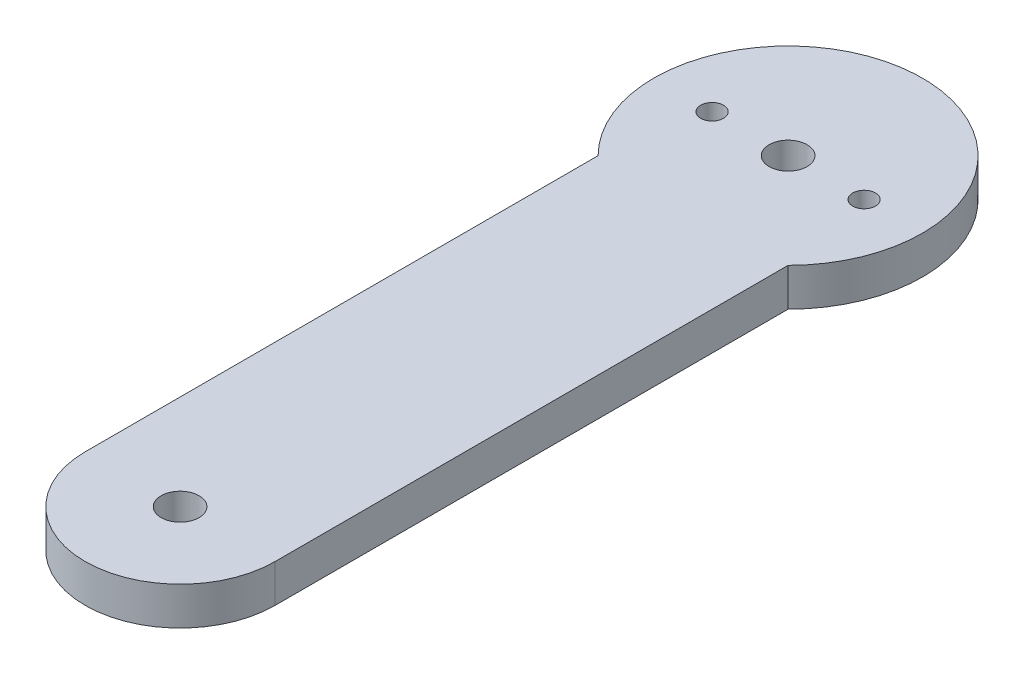
ISO-10303-21;
HEADER;
FILE_DESCRIPTION(('STEP AP214'),'2;1');
FILE_NAME('part.step','',(''),(''),'','','');
FILE_SCHEMA(('AUTOMOTIVE_DESIGN { 1 0 10303 214 1 1 1 1 }'));
ENDSEC;
DATA;
#1=APPLICATION_CONTEXT('core data for automotive mechanical design processes');
#2=APPLICATION_PROTOCOL_DEFINITION('international standard','automotive_design',2000,#1);
#3=PRODUCT_CONTEXT('',#1,'mechanical');
#4=PRODUCT('Part','Part','',(#3));
#5=PRODUCT_RELATED_PRODUCT_CATEGORY('part','',(#4));
#6=PRODUCT_DEFINITION_FORMATION('','',#4);
#7=PRODUCT_DEFINITION_CONTEXT('part definition',#1,'design');
#8=PRODUCT_DEFINITION('design','',#6,#7);
#9=PRODUCT_DEFINITION_SHAPE('','',#8);
#10=(LENGTH_UNIT() NAMED_UNIT(*) SI_UNIT(.MILLI.,.METRE.));
#11=(NAMED_UNIT(*) PLANE_ANGLE_UNIT() SI_UNIT($,.RADIAN.));
#12=(NAMED_UNIT(*) SI_UNIT($,.STERADIAN.) SOLID_ANGLE_UNIT());
#13=UNCERTAINTY_MEASURE_WITH_UNIT(LENGTH_MEASURE(1.E-05),#10,'distance_accuracy_value','');
#14=(GEOMETRIC_REPRESENTATION_CONTEXT(3) GLOBAL_UNCERTAINTY_ASSIGNED_CONTEXT((#13)) GLOBAL_UNIT_ASSIGNED_CONTEXT((#10,
#11,#12)) REPRESENTATION_CONTEXT('',''));
#15=CARTESIAN_POINT('',(0.,0.,0.));
#16=DIRECTION('',(0.,0.,1.));
#17=DIRECTION('',(1.,0.,0.));
#18=AXIS2_PLACEMENT_3D('',#15,#16,#17);
#19=CARTESIAN_POINT('',(0.,5.,0.));
#20=DIRECTION('',(0.,-1.,0.));
#21=DIRECTION('',(0.,0.,-1.));
#22=AXIS2_PLACEMENT_3D('',#19,#20,#21);
#23=PLANE('',#22);
#24=CARTESIAN_POINT('',(0.,5.,0.));
#25=DIRECTION('',(0.,1.,0.));
#26=DIRECTION('',(0.,0.,-1.));
#27=AXIS2_PLACEMENT_3D('',#24,#25,#26);
#28=CIRCLE('',#27,12.5);
#29=CARTESIAN_POINT('',(-12.5,5.,0.));
#30=VERTEX_POINT('',#29);
#31=CARTESIAN_POINT('',(12.5,5.,0.));
#32=VERTEX_POINT('',#31);
#33=EDGE_CURVE('E92',#30,#32,#28,.T.);
#34=ORIENTED_EDGE('',*,*,#33,.T.);
#35=DIRECTION('',(0.,0.,-1.));
#36=VECTOR('',#35,1.);
#37=CARTESIAN_POINT('',(12.5,5.,-67.5));
#38=LINE('',#37,#36);
#39=CARTESIAN_POINT('',(12.5,5.,-67.5));
#40=VERTEX_POINT('',#39);
#41=EDGE_CURVE('E87',#32,#40,#38,.T.);
#42=ORIENTED_EDGE('',*,*,#41,.T.);
#43=CARTESIAN_POINT('',(0.,5.,-80.));
#44=DIRECTION('',(0.,1.,0.));
#45=DIRECTION('',(0.,0.,1.));
#46=AXIS2_PLACEMENT_3D('',#43,#44,#45);
#47=CIRCLE('',#46,17.6776695296637);
#48=CARTESIAN_POINT('',(-12.5,5.,-67.5));
#49=VERTEX_POINT('',#48);
#50=EDGE_CURVE('E90',#40,#49,#47,.T.);
#51=ORIENTED_EDGE('',*,*,#50,.T.);
#52=DIRECTION('',(0.,0.,1.));
#53=VECTOR('',#52,1.);
#54=CARTESIAN_POINT('',(-12.5,5.,-67.5));
#55=LINE('',#54,#53);
#56=EDGE_CURVE('E57',#49,#30,#55,.T.);
#57=ORIENTED_EDGE('',*,*,#56,.T.);
#58=EDGE_LOOP('',(#34,#42,#51,#57));
#59=FACE_BOUND('',#58,.T.);
#60=CARTESIAN_POINT('',(0.,5.,0.));
#61=DIRECTION('',(0.,1.,0.));
#62=DIRECTION('',(0.,0.,1.));
#63=AXIS2_PLACEMENT_3D('',#60,#61,#62);
#64=CIRCLE('',#63,2.5);
#65=CARTESIAN_POINT('',(0.,5.,2.5));
#66=VERTEX_POINT('',#65);
#67=EDGE_CURVE('E112',#66,#66,#64,.T.);
#68=ORIENTED_EDGE('',*,*,#67,.F.);
#69=EDGE_LOOP('',(#68));
#70=FACE_BOUND('',#69,.T.);
#71=CARTESIAN_POINT('',(0.,5.,-80.));
#72=DIRECTION('',(0.,1.,0.));
#73=DIRECTION('',(0.,0.,1.));
#74=AXIS2_PLACEMENT_3D('',#71,#72,#73);
#75=CIRCLE('',#74,2.5);
#76=CARTESIAN_POINT('',(0.,5.,-77.5));
#77=VERTEX_POINT('',#76);
#78=EDGE_CURVE('E134',#77,#77,#75,.T.);
#79=ORIENTED_EDGE('',*,*,#78,.F.);
#80=EDGE_LOOP('',(#79));
#81=FACE_BOUND('',#80,.T.);
#82=CARTESIAN_POINT('',(10.,5.,-80.));
#83=DIRECTION('',(0.,1.,0.));
#84=DIRECTION('',(0.,0.,1.));
#85=AXIS2_PLACEMENT_3D('',#82,#83,#84);
#86=CIRCLE('',#85,1.5);
#87=CARTESIAN_POINT('',(10.,5.,-78.5));
#88=VERTEX_POINT('',#87);
#89=EDGE_CURVE('E142',#88,#88,#86,.T.);
#90=ORIENTED_EDGE('',*,*,#89,.F.);
#91=EDGE_LOOP('',(#90));
#92=FACE_BOUND('',#91,.T.);
#93=CARTESIAN_POINT('',(-10.,5.,-80.));
#94=DIRECTION('',(0.,1.,0.));
#95=DIRECTION('',(0.,0.,-1.));
#96=AXIS2_PLACEMENT_3D('',#93,#94,#95);
#97=CIRCLE('',#96,1.5);
#98=CARTESIAN_POINT('',(-10.,5.,-81.5));
#99=VERTEX_POINT('',#98);
#100=EDGE_CURVE('E150',#99,#99,#97,.T.);
#101=ORIENTED_EDGE('',*,*,#100,.F.);
#102=EDGE_LOOP('',(#101));
#103=FACE_BOUND('',#102,.T.);
#104=ADVANCED_FACE('F39',(#59,#70,#81,#92,#103),#23,.F.);
#105=CARTESIAN_POINT('',(0.,0.,0.));
#106=DIRECTION('',(0.,-1.,0.));
#107=DIRECTION('',(0.,0.,-1.));
#108=AXIS2_PLACEMENT_3D('',#105,#106,#107);
#109=PLANE('',#108);
#110=CARTESIAN_POINT('',(10.,0.,-80.));
#111=DIRECTION('',(0.,1.,0.));
#112=DIRECTION('',(0.,0.,1.));
#113=AXIS2_PLACEMENT_3D('',#110,#111,#112);
#114=CIRCLE('',#113,1.5);
#115=CARTESIAN_POINT('',(10.,0.,-78.5));
#116=VERTEX_POINT('',#115);
#117=EDGE_CURVE('E146',#116,#116,#114,.T.);
#118=ORIENTED_EDGE('',*,*,#117,.T.);
#119=EDGE_LOOP('',(#118));
#120=FACE_BOUND('',#119,.T.);
#121=CARTESIAN_POINT('',(0.,0.,0.));
#122=DIRECTION('',(0.,1.,0.));
#123=DIRECTION('',(0.,0.,1.));
#124=AXIS2_PLACEMENT_3D('',#121,#122,#123);
#125=CIRCLE('',#124,2.5);
#126=CARTESIAN_POINT('',(0.,0.,2.5));
#127=VERTEX_POINT('',#126);
#128=EDGE_CURVE('E130',#127,#127,#125,.T.);
#129=ORIENTED_EDGE('',*,*,#128,.T.);
#130=EDGE_LOOP('',(#129));
#131=FACE_BOUND('',#130,.T.);
#132=CARTESIAN_POINT('',(0.,0.,0.));
#133=DIRECTION('',(0.,1.,0.));
#134=DIRECTION('',(0.,0.,-1.));
#135=AXIS2_PLACEMENT_3D('',#132,#133,#134);
#136=CIRCLE('',#135,12.5);
#137=CARTESIAN_POINT('',(-12.5,0.,0.));
#138=VERTEX_POINT('',#137);
#139=CARTESIAN_POINT('',(12.5,0.,0.));
#140=VERTEX_POINT('',#139);
#141=EDGE_CURVE('E108',#138,#140,#136,.T.);
#142=ORIENTED_EDGE('',*,*,#141,.F.);
#143=DIRECTION('',(0.,0.,1.));
#144=VECTOR('',#143,1.);
#145=CARTESIAN_POINT('',(-12.5,0.,-67.5));
#146=LINE('',#145,#144);
#147=CARTESIAN_POINT('',(-12.5,0.,-67.5));
#148=VERTEX_POINT('',#147);
#149=EDGE_CURVE('E80',#148,#138,#146,.T.);
#150=ORIENTED_EDGE('',*,*,#149,.F.);
#151=CARTESIAN_POINT('',(0.,0.,-80.));
#152=DIRECTION('',(0.,1.,0.));
#153=DIRECTION('',(0.,0.,1.));
#154=AXIS2_PLACEMENT_3D('',#151,#152,#153);
#155=CIRCLE('',#154,17.6776695296637);
#156=CARTESIAN_POINT('',(12.5,0.,-67.5));
#157=VERTEX_POINT('',#156);
#158=EDGE_CURVE('E74',#157,#148,#155,.T.);
#159=ORIENTED_EDGE('',*,*,#158,.F.);
#160=DIRECTION('',(0.,0.,-1.));
#161=VECTOR('',#160,1.);
#162=CARTESIAN_POINT('',(12.5,0.,-67.5));
#163=LINE('',#162,#161);
#164=EDGE_CURVE('E97',#140,#157,#163,.T.);
#165=ORIENTED_EDGE('',*,*,#164,.F.);
#166=EDGE_LOOP('',(#142,#150,#159,#165));
#167=FACE_BOUND('',#166,.T.);
#168=CARTESIAN_POINT('',(0.,0.,-80.));
#169=DIRECTION('',(0.,1.,0.));
#170=DIRECTION('',(0.,0.,1.));
#171=AXIS2_PLACEMENT_3D('',#168,#169,#170);
#172=CIRCLE('',#171,2.5);
#173=CARTESIAN_POINT('',(0.,0.,-77.5));
#174=VERTEX_POINT('',#173);
#175=EDGE_CURVE('E138',#174,#174,#172,.T.);
#176=ORIENTED_EDGE('',*,*,#175,.T.);
#177=EDGE_LOOP('',(#176));
#178=FACE_BOUND('',#177,.T.);
#179=CARTESIAN_POINT('',(-10.,0.,-80.));
#180=DIRECTION('',(0.,1.,0.));
#181=DIRECTION('',(0.,0.,-1.));
#182=AXIS2_PLACEMENT_3D('',#179,#180,#181);
#183=CIRCLE('',#182,1.5);
#184=CARTESIAN_POINT('',(-10.,0.,-81.5));
#185=VERTEX_POINT('',#184);
#186=EDGE_CURVE('E154',#185,#185,#183,.T.);
#187=ORIENTED_EDGE('',*,*,#186,.T.);
#188=EDGE_LOOP('',(#187));
#189=FACE_BOUND('',#188,.T.);
#190=ADVANCED_FACE('F125',(#120,#131,#167,#178,#189),#109,.T.);
#191=CARTESIAN_POINT('',(0.,5.,0.));
#192=DIRECTION('',(0.,-1.,0.));
#193=DIRECTION('',(0.,0.,-1.));
#194=AXIS2_PLACEMENT_3D('',#191,#192,#193);
#195=CYLINDRICAL_SURFACE('',#194,12.5);
#196=ORIENTED_EDGE('',*,*,#141,.T.);
#197=DIRECTION('',(0.,-1.,0.));
#198=VECTOR('',#197,1.);
#199=CARTESIAN_POINT('',(12.5,5.,0.));
#200=LINE('',#199,#198);
#201=EDGE_CURVE('E11',#32,#140,#200,.T.);
#202=ORIENTED_EDGE('',*,*,#201,.F.);
#203=ORIENTED_EDGE('',*,*,#33,.F.);
#204=DIRECTION('',(0.,-1.,0.));
#205=VECTOR('',#204,1.);
#206=CARTESIAN_POINT('',(-12.5,5.,0.));
#207=LINE('',#206,#205);
#208=EDGE_CURVE('E104',#30,#138,#207,.T.);
#209=ORIENTED_EDGE('',*,*,#208,.T.);
#210=EDGE_LOOP('',(#196,#202,#203,#209));
#211=FACE_BOUND('',#210,.T.);
#212=ADVANCED_FACE('F41',(#211),#195,.T.);
#213=CARTESIAN_POINT('',(12.5,5.,-67.5));
#214=DIRECTION('',(-1.,0.,0.));
#215=DIRECTION('',(0.,0.,1.));
#216=AXIS2_PLACEMENT_3D('',#213,#214,#215);
#217=PLANE('',#216);
#218=ORIENTED_EDGE('',*,*,#164,.T.);
#219=DIRECTION('',(0.,-1.,0.));
#220=VECTOR('',#219,1.);
#221=CARTESIAN_POINT('',(12.5,5.,-67.5));
#222=LINE('',#221,#220);
#223=EDGE_CURVE('E49',#40,#157,#222,.T.);
#224=ORIENTED_EDGE('',*,*,#223,.F.);
#225=ORIENTED_EDGE('',*,*,#41,.F.);
#226=ORIENTED_EDGE('',*,*,#201,.T.);
#227=EDGE_LOOP('',(#218,#224,#225,#226));
#228=FACE_BOUND('',#227,.T.);
#229=ADVANCED_FACE('F96',(#228),#217,.F.);
#230=CARTESIAN_POINT('',(0.,5.,-80.));
#231=DIRECTION('',(0.,-1.,0.));
#232=DIRECTION('',(0.,0.,-1.));
#233=AXIS2_PLACEMENT_3D('',#230,#231,#232);
#234=CYLINDRICAL_SURFACE('',#233,17.6776695296637);
#235=ORIENTED_EDGE('',*,*,#158,.T.);
#236=DIRECTION('',(0.,-1.,0.));
#237=VECTOR('',#236,1.);
#238=CARTESIAN_POINT('',(-12.5,5.,-67.5));
#239=LINE('',#238,#237);
#240=EDGE_CURVE('E99',#49,#148,#239,.T.);
#241=ORIENTED_EDGE('',*,*,#240,.F.);
#242=ORIENTED_EDGE('',*,*,#50,.F.);
#243=ORIENTED_EDGE('',*,*,#223,.T.);
#244=EDGE_LOOP('',(#235,#241,#242,#243));
#245=FACE_BOUND('',#244,.T.);
#246=ADVANCED_FACE('F100',(#245),#234,.T.);
#247=CARTESIAN_POINT('',(-12.5,5.,-67.5));
#248=DIRECTION('',(1.,0.,0.));
#249=DIRECTION('',(0.,0.,-1.));
#250=AXIS2_PLACEMENT_3D('',#247,#248,#249);
#251=PLANE('',#250);
#252=ORIENTED_EDGE('',*,*,#149,.T.);
#253=ORIENTED_EDGE('',*,*,#208,.F.);
#254=ORIENTED_EDGE('',*,*,#56,.F.);
#255=ORIENTED_EDGE('',*,*,#240,.T.);
#256=EDGE_LOOP('',(#252,#253,#254,#255));
#257=FACE_BOUND('',#256,.T.);
#258=ADVANCED_FACE('F122',(#257),#251,.F.);
#259=CARTESIAN_POINT('',(0.,5.,0.));
#260=DIRECTION('',(0.,-1.,0.));
#261=DIRECTION('',(0.,0.,-1.));
#262=AXIS2_PLACEMENT_3D('',#259,#260,#261);
#263=CYLINDRICAL_SURFACE('',#262,2.5);
#264=ORIENTED_EDGE('',*,*,#67,.T.);
#265=EDGE_LOOP('',(#264));
#266=FACE_BOUND('',#265,.T.);
#267=ORIENTED_EDGE('',*,*,#128,.F.);
#268=EDGE_LOOP('',(#267));
#269=FACE_BOUND('',#268,.T.);
#270=ADVANCED_FACE('F173',(#266,#269),#263,.F.);
#271=CARTESIAN_POINT('',(0.,5.,-80.));
#272=DIRECTION('',(0.,-1.,0.));
#273=DIRECTION('',(0.,0.,-1.));
#274=AXIS2_PLACEMENT_3D('',#271,#272,#273);
#275=CYLINDRICAL_SURFACE('',#274,2.5);
#276=ORIENTED_EDGE('',*,*,#78,.T.);
#277=EDGE_LOOP('',(#276));
#278=FACE_BOUND('',#277,.T.);
#279=ORIENTED_EDGE('',*,*,#175,.F.);
#280=EDGE_LOOP('',(#279));
#281=FACE_BOUND('',#280,.T.);
#282=ADVANCED_FACE('F219',(#278,#281),#275,.F.);
#283=CARTESIAN_POINT('',(10.,5.,-80.));
#284=DIRECTION('',(0.,-1.,0.));
#285=DIRECTION('',(0.,0.,-1.));
#286=AXIS2_PLACEMENT_3D('',#283,#284,#285);
#287=CYLINDRICAL_SURFACE('',#286,1.5);
#288=ORIENTED_EDGE('',*,*,#89,.T.);
#289=EDGE_LOOP('',(#288));
#290=FACE_BOUND('',#289,.T.);
#291=ORIENTED_EDGE('',*,*,#117,.F.);
#292=EDGE_LOOP('',(#291));
#293=FACE_BOUND('',#292,.T.);
#294=ADVANCED_FACE('F227',(#290,#293),#287,.F.);
#295=CARTESIAN_POINT('',(-10.,5.,-80.));
#296=DIRECTION('',(0.,-1.,0.));
#297=DIRECTION('',(0.,0.,-1.));
#298=AXIS2_PLACEMENT_3D('',#295,#296,#297);
#299=CYLINDRICAL_SURFACE('',#298,1.5);
#300=ORIENTED_EDGE('',*,*,#100,.T.);
#301=EDGE_LOOP('',(#300));
#302=FACE_BOUND('',#301,.T.);
#303=ORIENTED_EDGE('',*,*,#186,.F.);
#304=EDGE_LOOP('',(#303));
#305=FACE_BOUND('',#304,.T.);
#306=ADVANCED_FACE('F162',(#302,#305),#299,.F.);
#307=CLOSED_SHELL('',(#104,#190,#212,#229,#246,#258,#270,#282,#294,#306));
#308=MANIFOLD_SOLID_BREP('B2',#307);
#309=ADVANCED_BREP_SHAPE_REPRESENTATION('',(#18,#308),#14);
#310=SHAPE_DEFINITION_REPRESENTATION(#9,#309);
ENDSEC;
END-ISO-10303-21;
